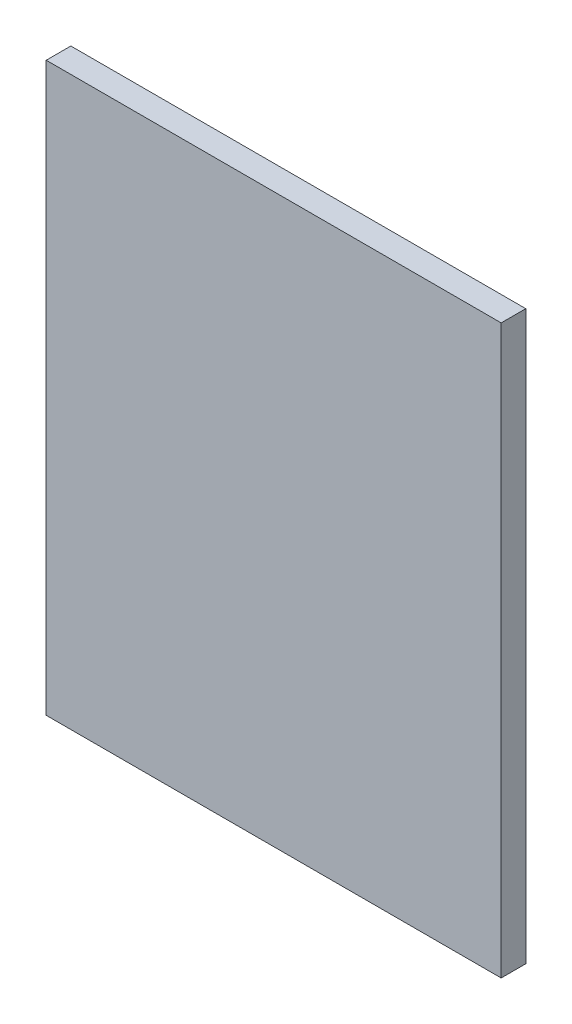
ISO-10303-21;
HEADER;
FILE_DESCRIPTION(('STEP AP214'),'2;1');
FILE_NAME('part.step','',(''),(''),'','','');
FILE_SCHEMA(('AUTOMOTIVE_DESIGN { 1 0 10303 214 1 1 1 1 }'));
ENDSEC;
DATA;
#1=APPLICATION_CONTEXT('core data for automotive mechanical design processes');
#2=APPLICATION_PROTOCOL_DEFINITION('international standard','automotive_design',2000,#1);
#3=PRODUCT_CONTEXT('',#1,'mechanical');
#4=PRODUCT('Part','Part','',(#3));
#5=PRODUCT_RELATED_PRODUCT_CATEGORY('part','',(#4));
#6=PRODUCT_DEFINITION_FORMATION('','',#4);
#7=PRODUCT_DEFINITION_CONTEXT('part definition',#1,'design');
#8=PRODUCT_DEFINITION('design','',#6,#7);
#9=PRODUCT_DEFINITION_SHAPE('','',#8);
#10=(LENGTH_UNIT() NAMED_UNIT(*) SI_UNIT(.MILLI.,.METRE.));
#11=(NAMED_UNIT(*) PLANE_ANGLE_UNIT() SI_UNIT($,.RADIAN.));
#12=(NAMED_UNIT(*) SI_UNIT($,.STERADIAN.) SOLID_ANGLE_UNIT());
#13=UNCERTAINTY_MEASURE_WITH_UNIT(LENGTH_MEASURE(1.E-05),#10,'distance_accuracy_value','');
#14=(GEOMETRIC_REPRESENTATION_CONTEXT(3) GLOBAL_UNCERTAINTY_ASSIGNED_CONTEXT((#13)) GLOBAL_UNIT_ASSIGNED_CONTEXT((#10,
#11,#12)) REPRESENTATION_CONTEXT('',''));
#15=CARTESIAN_POINT('',(0.,0.,0.));
#16=DIRECTION('',(0.,0.,1.));
#17=DIRECTION('',(1.,0.,0.));
#18=AXIS2_PLACEMENT_3D('',#15,#16,#17);
#19=CARTESIAN_POINT('',(21.25,-26.5,2.3));
#20=DIRECTION('',(-1.,0.,0.));
#21=DIRECTION('',(0.,0.,1.));
#22=AXIS2_PLACEMENT_3D('',#19,#20,#21);
#23=PLANE('',#22);
#24=DIRECTION('',(0.,1.,0.));
#25=VECTOR('',#24,1.);
#26=CARTESIAN_POINT('',(21.25,-26.5,0.));
#27=LINE('',#26,#25);
#28=CARTESIAN_POINT('',(21.25,-26.5,0.));
#29=VERTEX_POINT('',#28);
#30=CARTESIAN_POINT('',(21.25,26.5,0.));
#31=VERTEX_POINT('',#30);
#32=EDGE_CURVE('E113',#29,#31,#27,.T.);
#33=ORIENTED_EDGE('',*,*,#32,.T.);
#34=DIRECTION('',(0.,0.,-1.));
#35=VECTOR('',#34,1.);
#36=CARTESIAN_POINT('',(21.25,26.5,2.3));
#37=LINE('',#36,#35);
#38=CARTESIAN_POINT('',(21.25,26.5,2.3));
#39=VERTEX_POINT('',#38);
#40=EDGE_CURVE('E11',#39,#31,#37,.T.);
#41=ORIENTED_EDGE('',*,*,#40,.F.);
#42=DIRECTION('',(0.,1.,0.));
#43=VECTOR('',#42,1.);
#44=CARTESIAN_POINT('',(21.25,-26.5,2.3));
#45=LINE('',#44,#43);
#46=CARTESIAN_POINT('',(21.25,-26.5,2.3));
#47=VERTEX_POINT('',#46);
#48=EDGE_CURVE('E97',#47,#39,#45,.T.);
#49=ORIENTED_EDGE('',*,*,#48,.F.);
#50=DIRECTION('',(0.,0.,-1.));
#51=VECTOR('',#50,1.);
#52=CARTESIAN_POINT('',(21.25,-26.5,2.3));
#53=LINE('',#52,#51);
#54=EDGE_CURVE('E109',#47,#29,#53,.T.);
#55=ORIENTED_EDGE('',*,*,#54,.T.);
#56=EDGE_LOOP('',(#33,#41,#49,#55));
#57=FACE_BOUND('',#56,.T.);
#58=ADVANCED_FACE('F45',(#57),#23,.F.);
#59=CARTESIAN_POINT('',(-21.25,26.5,2.3));
#60=DIRECTION('',(0.,-1.,0.));
#61=DIRECTION('',(0.,0.,-1.));
#62=AXIS2_PLACEMENT_3D('',#59,#60,#61);
#63=PLANE('',#62);
#64=DIRECTION('',(-1.,0.,0.));
#65=VECTOR('',#64,1.);
#66=CARTESIAN_POINT('',(-21.25,26.5,0.));
#67=LINE('',#66,#65);
#68=CARTESIAN_POINT('',(-21.25,26.5,0.));
#69=VERTEX_POINT('',#68);
#70=EDGE_CURVE('E102',#31,#69,#67,.T.);
#71=ORIENTED_EDGE('',*,*,#70,.T.);
#72=DIRECTION('',(0.,0.,-1.));
#73=VECTOR('',#72,1.);
#74=CARTESIAN_POINT('',(-21.25,26.5,2.3));
#75=LINE('',#74,#73);
#76=CARTESIAN_POINT('',(-21.25,26.5,2.3));
#77=VERTEX_POINT('',#76);
#78=EDGE_CURVE('E54',#77,#69,#75,.T.);
#79=ORIENTED_EDGE('',*,*,#78,.F.);
#80=DIRECTION('',(-1.,0.,0.));
#81=VECTOR('',#80,1.);
#82=CARTESIAN_POINT('',(-21.25,26.5,2.3));
#83=LINE('',#82,#81);
#84=EDGE_CURVE('E92',#39,#77,#83,.T.);
#85=ORIENTED_EDGE('',*,*,#84,.F.);
#86=ORIENTED_EDGE('',*,*,#40,.T.);
#87=EDGE_LOOP('',(#71,#79,#85,#86));
#88=FACE_BOUND('',#87,.T.);
#89=ADVANCED_FACE('F101',(#88),#63,.F.);
#90=CARTESIAN_POINT('',(-21.25,-26.5,2.3));
#91=DIRECTION('',(1.,0.,0.));
#92=DIRECTION('',(0.,0.,-1.));
#93=AXIS2_PLACEMENT_3D('',#90,#91,#92);
#94=PLANE('',#93);
#95=DIRECTION('',(0.,-1.,0.));
#96=VECTOR('',#95,1.);
#97=CARTESIAN_POINT('',(-21.25,-26.5,0.));
#98=LINE('',#97,#96);
#99=CARTESIAN_POINT('',(-21.25,-26.5,0.));
#100=VERTEX_POINT('',#99);
#101=EDGE_CURVE('E79',#69,#100,#98,.T.);
#102=ORIENTED_EDGE('',*,*,#101,.T.);
#103=DIRECTION('',(0.,0.,-1.));
#104=VECTOR('',#103,1.);
#105=CARTESIAN_POINT('',(-21.25,-26.5,2.3));
#106=LINE('',#105,#104);
#107=CARTESIAN_POINT('',(-21.25,-26.5,2.3));
#108=VERTEX_POINT('',#107);
#109=EDGE_CURVE('E104',#108,#100,#106,.T.);
#110=ORIENTED_EDGE('',*,*,#109,.F.);
#111=DIRECTION('',(0.,-1.,0.));
#112=VECTOR('',#111,1.);
#113=CARTESIAN_POINT('',(-21.25,-26.5,2.3));
#114=LINE('',#113,#112);
#115=EDGE_CURVE('E95',#77,#108,#114,.T.);
#116=ORIENTED_EDGE('',*,*,#115,.F.);
#117=ORIENTED_EDGE('',*,*,#78,.T.);
#118=EDGE_LOOP('',(#102,#110,#116,#117));
#119=FACE_BOUND('',#118,.T.);
#120=ADVANCED_FACE('F105',(#119),#94,.F.);
#121=CARTESIAN_POINT('',(-21.25,-26.5,2.3));
#122=DIRECTION('',(0.,1.,0.));
#123=DIRECTION('',(0.,0.,1.));
#124=AXIS2_PLACEMENT_3D('',#121,#122,#123);
#125=PLANE('',#124);
#126=DIRECTION('',(1.,0.,0.));
#127=VECTOR('',#126,1.);
#128=CARTESIAN_POINT('',(-21.25,-26.5,0.));
#129=LINE('',#128,#127);
#130=EDGE_CURVE('E85',#100,#29,#129,.T.);
#131=ORIENTED_EDGE('',*,*,#130,.T.);
#132=ORIENTED_EDGE('',*,*,#54,.F.);
#133=DIRECTION('',(1.,0.,0.));
#134=VECTOR('',#133,1.);
#135=CARTESIAN_POINT('',(-21.25,-26.5,2.3));
#136=LINE('',#135,#134);
#137=EDGE_CURVE('E62',#108,#47,#136,.T.);
#138=ORIENTED_EDGE('',*,*,#137,.F.);
#139=ORIENTED_EDGE('',*,*,#109,.T.);
#140=EDGE_LOOP('',(#131,#132,#138,#139));
#141=FACE_BOUND('',#140,.T.);
#142=ADVANCED_FACE('F126',(#141),#125,.F.);
#143=CARTESIAN_POINT('',(0.,0.,2.3));
#144=DIRECTION('',(0.,0.,-1.));
#145=DIRECTION('',(-1.,0.,0.));
#146=AXIS2_PLACEMENT_3D('',#143,#144,#145);
#147=PLANE('',#146);
#148=ORIENTED_EDGE('',*,*,#48,.T.);
#149=ORIENTED_EDGE('',*,*,#84,.T.);
#150=ORIENTED_EDGE('',*,*,#115,.T.);
#151=ORIENTED_EDGE('',*,*,#137,.T.);
#152=EDGE_LOOP('',(#148,#149,#150,#151));
#153=FACE_BOUND('',#152,.T.);
#154=ADVANCED_FACE('F93',(#153),#147,.F.);
#155=CARTESIAN_POINT('',(0.,0.,0.));
#156=DIRECTION('',(0.,0.,-1.));
#157=DIRECTION('',(-1.,0.,0.));
#158=AXIS2_PLACEMENT_3D('',#155,#156,#157);
#159=PLANE('',#158);
#160=ORIENTED_EDGE('',*,*,#32,.F.);
#161=ORIENTED_EDGE('',*,*,#130,.F.);
#162=ORIENTED_EDGE('',*,*,#101,.F.);
#163=ORIENTED_EDGE('',*,*,#70,.F.);
#164=EDGE_LOOP('',(#160,#161,#162,#163));
#165=FACE_BOUND('',#164,.T.);
#166=ADVANCED_FACE('F129',(#165),#159,.T.);
#167=CLOSED_SHELL('',(#58,#89,#120,#142,#154,#166));
#168=MANIFOLD_SOLID_BREP('B2',#167);
#169=ADVANCED_BREP_SHAPE_REPRESENTATION('',(#18,#168),#14);
#170=SHAPE_DEFINITION_REPRESENTATION(#9,#169);
ENDSEC;
END-ISO-10303-21;
